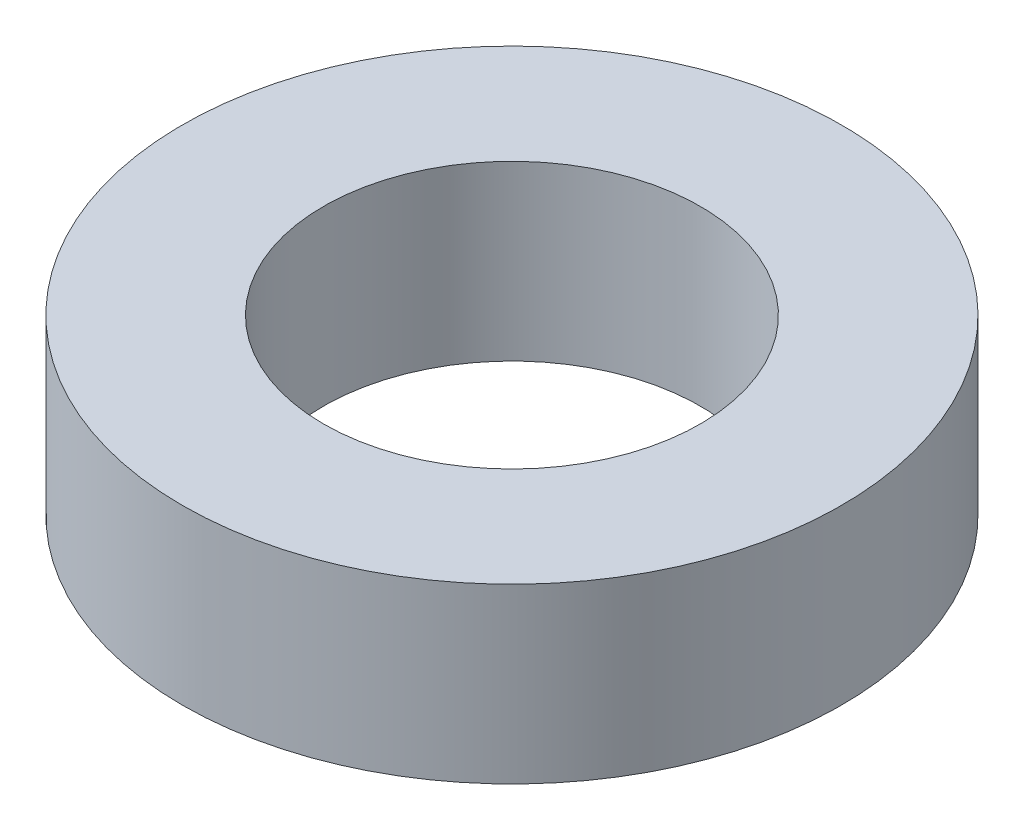
ISO-10303-21;
HEADER;
FILE_DESCRIPTION(('STEP AP214'),'2;1');
FILE_NAME('part.step','',(''),(''),'','','');
FILE_SCHEMA(('AUTOMOTIVE_DESIGN { 1 0 10303 214 1 1 1 1 }'));
ENDSEC;
DATA;
#1=APPLICATION_CONTEXT('core data for automotive mechanical design processes');
#2=APPLICATION_PROTOCOL_DEFINITION('international standard','automotive_design',2000,#1);
#3=PRODUCT_CONTEXT('',#1,'mechanical');
#4=PRODUCT('Part','Part','',(#3));
#5=PRODUCT_RELATED_PRODUCT_CATEGORY('part','',(#4));
#6=PRODUCT_DEFINITION_FORMATION('','',#4);
#7=PRODUCT_DEFINITION_CONTEXT('part definition',#1,'design');
#8=PRODUCT_DEFINITION('design','',#6,#7);
#9=PRODUCT_DEFINITION_SHAPE('','',#8);
#10=(LENGTH_UNIT() NAMED_UNIT(*) SI_UNIT(.MILLI.,.METRE.));
#11=(NAMED_UNIT(*) PLANE_ANGLE_UNIT() SI_UNIT($,.RADIAN.));
#12=(NAMED_UNIT(*) SI_UNIT($,.STERADIAN.) SOLID_ANGLE_UNIT());
#13=UNCERTAINTY_MEASURE_WITH_UNIT(LENGTH_MEASURE(1.E-05),#10,'distance_accuracy_value','');
#14=(GEOMETRIC_REPRESENTATION_CONTEXT(3) GLOBAL_UNCERTAINTY_ASSIGNED_CONTEXT((#13)) GLOBAL_UNIT_ASSIGNED_CONTEXT((#10,
#11,#12)) REPRESENTATION_CONTEXT('',''));
#15=CARTESIAN_POINT('',(0.,0.,0.));
#16=DIRECTION('',(0.,0.,1.));
#17=DIRECTION('',(1.,0.,0.));
#18=AXIS2_PLACEMENT_3D('',#15,#16,#17);
#19=CARTESIAN_POINT('',(0.,2.8,0.));
#20=DIRECTION('',(0.,1.,0.));
#21=DIRECTION('',(0.,0.,1.));
#22=AXIS2_PLACEMENT_3D('',#19,#20,#21);
#23=PLANE('',#22);
#24=CARTESIAN_POINT('',(0.,2.8,0.));
#25=DIRECTION('',(0.,1.,0.));
#26=DIRECTION('',(0.,0.,1.));
#27=AXIS2_PLACEMENT_3D('',#24,#25,#26);
#28=CIRCLE('',#27,5.334);
#29=CARTESIAN_POINT('',(0.,2.8,5.334));
#30=VERTEX_POINT('',#29);
#31=EDGE_CURVE('E10',#30,#30,#28,.T.);
#32=ORIENTED_EDGE('',*,*,#31,.T.);
#33=EDGE_LOOP('',(#32));
#34=FACE_BOUND('',#33,.T.);
#35=CARTESIAN_POINT('',(0.,2.8,0.));
#36=DIRECTION('',(0.,1.,0.));
#37=DIRECTION('',(0.,0.,1.));
#38=AXIS2_PLACEMENT_3D('',#35,#36,#37);
#39=CIRCLE('',#38,3.05);
#40=CARTESIAN_POINT('',(0.,2.8,3.05));
#41=VERTEX_POINT('',#40);
#42=EDGE_CURVE('E44',#41,#41,#39,.T.);
#43=ORIENTED_EDGE('',*,*,#42,.F.);
#44=EDGE_LOOP('',(#43));
#45=FACE_BOUND('',#44,.T.);
#46=ADVANCED_FACE('F33',(#34,#45),#23,.T.);
#47=CARTESIAN_POINT('',(0.,0.,0.));
#48=DIRECTION('',(0.,1.,0.));
#49=DIRECTION('',(0.,0.,1.));
#50=AXIS2_PLACEMENT_3D('',#47,#48,#49);
#51=PLANE('',#50);
#52=CARTESIAN_POINT('',(0.,0.,0.));
#53=DIRECTION('',(0.,1.,0.));
#54=DIRECTION('',(0.,0.,1.));
#55=AXIS2_PLACEMENT_3D('',#52,#53,#54);
#56=CIRCLE('',#55,5.334);
#57=CARTESIAN_POINT('',(0.,0.,5.334));
#58=VERTEX_POINT('',#57);
#59=EDGE_CURVE('E37',#58,#58,#56,.T.);
#60=ORIENTED_EDGE('',*,*,#59,.F.);
#61=EDGE_LOOP('',(#60));
#62=FACE_BOUND('',#61,.T.);
#63=CARTESIAN_POINT('',(0.,0.,0.));
#64=DIRECTION('',(0.,1.,0.));
#65=DIRECTION('',(0.,0.,1.));
#66=AXIS2_PLACEMENT_3D('',#63,#64,#65);
#67=CIRCLE('',#66,3.05);
#68=CARTESIAN_POINT('',(0.,0.,3.05));
#69=VERTEX_POINT('',#68);
#70=EDGE_CURVE('E46',#69,#69,#67,.T.);
#71=ORIENTED_EDGE('',*,*,#70,.T.);
#72=EDGE_LOOP('',(#71));
#73=FACE_BOUND('',#72,.T.);
#74=ADVANCED_FACE('F56',(#62,#73),#51,.F.);
#75=CARTESIAN_POINT('',(0.,2.8,0.));
#76=DIRECTION('',(0.,-1.,0.));
#77=DIRECTION('',(0.,0.,-1.));
#78=AXIS2_PLACEMENT_3D('',#75,#76,#77);
#79=CYLINDRICAL_SURFACE('',#78,5.334);
#80=ORIENTED_EDGE('',*,*,#31,.F.);
#81=EDGE_LOOP('',(#80));
#82=FACE_BOUND('',#81,.T.);
#83=ORIENTED_EDGE('',*,*,#59,.T.);
#84=EDGE_LOOP('',(#83));
#85=FACE_BOUND('',#84,.T.);
#86=ADVANCED_FACE('F35',(#82,#85),#79,.T.);
#87=CARTESIAN_POINT('',(0.,2.8,0.));
#88=DIRECTION('',(0.,-1.,0.));
#89=DIRECTION('',(0.,0.,-1.));
#90=AXIS2_PLACEMENT_3D('',#87,#88,#89);
#91=CYLINDRICAL_SURFACE('',#90,3.05);
#92=ORIENTED_EDGE('',*,*,#42,.T.);
#93=EDGE_LOOP('',(#92));
#94=FACE_BOUND('',#93,.T.);
#95=ORIENTED_EDGE('',*,*,#70,.F.);
#96=EDGE_LOOP('',(#95));
#97=FACE_BOUND('',#96,.T.);
#98=ADVANCED_FACE('F52',(#94,#97),#91,.F.);
#99=CLOSED_SHELL('',(#46,#74,#86,#98));
#100=MANIFOLD_SOLID_BREP('B2',#99);
#101=ADVANCED_BREP_SHAPE_REPRESENTATION('',(#18,#100),#14);
#102=SHAPE_DEFINITION_REPRESENTATION(#9,#101);
ENDSEC;
END-ISO-10303-21;
